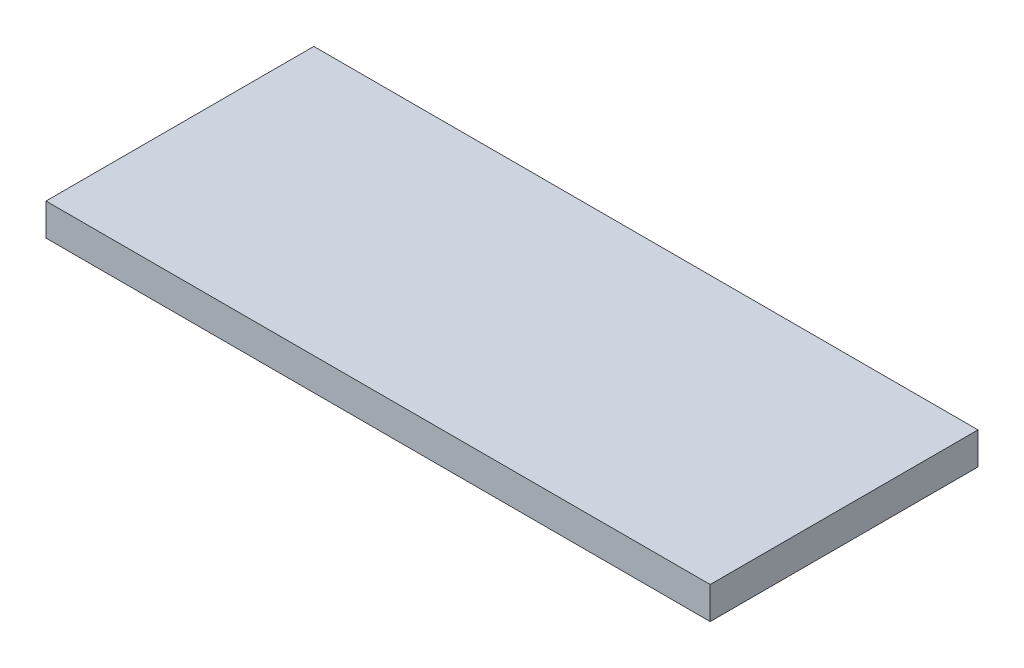
ISO-10303-21;
HEADER;
FILE_DESCRIPTION(('STEP AP214'),'2;1');
FILE_NAME('part.step','',(''),(''),'','','');
FILE_SCHEMA(('AUTOMOTIVE_DESIGN { 1 0 10303 214 1 1 1 1 }'));
ENDSEC;
DATA;
#1=APPLICATION_CONTEXT('core data for automotive mechanical design processes');
#2=APPLICATION_PROTOCOL_DEFINITION('international standard','automotive_design',2000,#1);
#3=PRODUCT_CONTEXT('',#1,'mechanical');
#4=PRODUCT('Part','Part','',(#3));
#5=PRODUCT_RELATED_PRODUCT_CATEGORY('part','',(#4));
#6=PRODUCT_DEFINITION_FORMATION('','',#4);
#7=PRODUCT_DEFINITION_CONTEXT('part definition',#1,'design');
#8=PRODUCT_DEFINITION('design','',#6,#7);
#9=PRODUCT_DEFINITION_SHAPE('','',#8);
#10=(LENGTH_UNIT() NAMED_UNIT(*) SI_UNIT(.MILLI.,.METRE.));
#11=(NAMED_UNIT(*) PLANE_ANGLE_UNIT() SI_UNIT($,.RADIAN.));
#12=(NAMED_UNIT(*) SI_UNIT($,.STERADIAN.) SOLID_ANGLE_UNIT());
#13=UNCERTAINTY_MEASURE_WITH_UNIT(LENGTH_MEASURE(1.E-05),#10,'distance_accuracy_value','');
#14=(GEOMETRIC_REPRESENTATION_CONTEXT(3) GLOBAL_UNCERTAINTY_ASSIGNED_CONTEXT((#13)) GLOBAL_UNIT_ASSIGNED_CONTEXT((#10,
#11,#12)) REPRESENTATION_CONTEXT('',''));
#15=CARTESIAN_POINT('',(0.,0.,0.));
#16=DIRECTION('',(0.,0.,1.));
#17=DIRECTION('',(1.,0.,0.));
#18=AXIS2_PLACEMENT_3D('',#15,#16,#17);
#19=CARTESIAN_POINT('',(-31.,3.,-12.5));
#20=DIRECTION('',(1.,0.,0.));
#21=DIRECTION('',(0.,0.,-1.));
#22=AXIS2_PLACEMENT_3D('',#19,#20,#21);
#23=PLANE('',#22);
#24=DIRECTION('',(0.,0.,1.));
#25=VECTOR('',#24,1.);
#26=CARTESIAN_POINT('',(-31.,0.,-12.5));
#27=LINE('',#26,#25);
#28=CARTESIAN_POINT('',(-31.,0.,-12.5));
#29=VERTEX_POINT('',#28);
#30=CARTESIAN_POINT('',(-31.,0.,12.5));
#31=VERTEX_POINT('',#30);
#32=EDGE_CURVE('E100',#29,#31,#27,.T.);
#33=ORIENTED_EDGE('',*,*,#32,.T.);
#34=DIRECTION('',(0.,-1.,0.));
#35=VECTOR('',#34,1.);
#36=CARTESIAN_POINT('',(-31.,3.,12.5));
#37=LINE('',#36,#35);
#38=CARTESIAN_POINT('',(-31.,3.,12.5));
#39=VERTEX_POINT('',#38);
#40=EDGE_CURVE('E11',#39,#31,#37,.T.);
#41=ORIENTED_EDGE('',*,*,#40,.F.);
#42=DIRECTION('',(0.,0.,1.));
#43=VECTOR('',#42,1.);
#44=CARTESIAN_POINT('',(-31.,3.,-12.5));
#45=LINE('',#44,#43);
#46=CARTESIAN_POINT('',(-31.,3.,-12.5));
#47=VERTEX_POINT('',#46);
#48=EDGE_CURVE('E88',#47,#39,#45,.T.);
#49=ORIENTED_EDGE('',*,*,#48,.F.);
#50=DIRECTION('',(0.,-1.,0.));
#51=VECTOR('',#50,1.);
#52=CARTESIAN_POINT('',(-31.,3.,-12.5));
#53=LINE('',#52,#51);
#54=EDGE_CURVE('E96',#47,#29,#53,.T.);
#55=ORIENTED_EDGE('',*,*,#54,.T.);
#56=EDGE_LOOP('',(#33,#41,#49,#55));
#57=FACE_BOUND('',#56,.T.);
#58=ADVANCED_FACE('F37',(#57),#23,.F.);
#59=CARTESIAN_POINT('',(31.,3.,12.5));
#60=DIRECTION('',(0.,0.,-1.));
#61=DIRECTION('',(-1.,0.,0.));
#62=AXIS2_PLACEMENT_3D('',#59,#60,#61);
#63=PLANE('',#62);
#64=DIRECTION('',(1.,0.,0.));
#65=VECTOR('',#64,1.);
#66=CARTESIAN_POINT('',(31.,0.,12.5));
#67=LINE('',#66,#65);
#68=CARTESIAN_POINT('',(31.,0.,12.5));
#69=VERTEX_POINT('',#68);
#70=EDGE_CURVE('E92',#31,#69,#67,.T.);
#71=ORIENTED_EDGE('',*,*,#70,.T.);
#72=DIRECTION('',(0.,-1.,0.));
#73=VECTOR('',#72,1.);
#74=CARTESIAN_POINT('',(31.,3.,12.5));
#75=LINE('',#74,#73);
#76=CARTESIAN_POINT('',(31.,3.,12.5));
#77=VERTEX_POINT('',#76);
#78=EDGE_CURVE('E45',#77,#69,#75,.T.);
#79=ORIENTED_EDGE('',*,*,#78,.F.);
#80=DIRECTION('',(1.,0.,0.));
#81=VECTOR('',#80,1.);
#82=CARTESIAN_POINT('',(31.,3.,12.5));
#83=LINE('',#82,#81);
#84=EDGE_CURVE('E83',#39,#77,#83,.T.);
#85=ORIENTED_EDGE('',*,*,#84,.F.);
#86=ORIENTED_EDGE('',*,*,#40,.T.);
#87=EDGE_LOOP('',(#71,#79,#85,#86));
#88=FACE_BOUND('',#87,.T.);
#89=ADVANCED_FACE('F91',(#88),#63,.F.);
#90=CARTESIAN_POINT('',(31.,3.,-12.5));
#91=DIRECTION('',(-1.,0.,0.));
#92=DIRECTION('',(0.,0.,1.));
#93=AXIS2_PLACEMENT_3D('',#90,#91,#92);
#94=PLANE('',#93);
#95=DIRECTION('',(0.,0.,-1.));
#96=VECTOR('',#95,1.);
#97=CARTESIAN_POINT('',(31.,0.,-12.5));
#98=LINE('',#97,#96);
#99=CARTESIAN_POINT('',(31.,0.,-12.5));
#100=VERTEX_POINT('',#99);
#101=EDGE_CURVE('E70',#69,#100,#98,.T.);
#102=ORIENTED_EDGE('',*,*,#101,.T.);
#103=DIRECTION('',(0.,-1.,0.));
#104=VECTOR('',#103,1.);
#105=CARTESIAN_POINT('',(31.,3.,-12.5));
#106=LINE('',#105,#104);
#107=CARTESIAN_POINT('',(31.,3.,-12.5));
#108=VERTEX_POINT('',#107);
#109=EDGE_CURVE('E93',#108,#100,#106,.T.);
#110=ORIENTED_EDGE('',*,*,#109,.F.);
#111=DIRECTION('',(0.,0.,-1.));
#112=VECTOR('',#111,1.);
#113=CARTESIAN_POINT('',(31.,3.,-12.5));
#114=LINE('',#113,#112);
#115=EDGE_CURVE('E86',#77,#108,#114,.T.);
#116=ORIENTED_EDGE('',*,*,#115,.F.);
#117=ORIENTED_EDGE('',*,*,#78,.T.);
#118=EDGE_LOOP('',(#102,#110,#116,#117));
#119=FACE_BOUND('',#118,.T.);
#120=ADVANCED_FACE('F94',(#119),#94,.F.);
#121=CARTESIAN_POINT('',(31.,3.,-12.5));
#122=DIRECTION('',(0.,0.,1.));
#123=DIRECTION('',(1.,0.,0.));
#124=AXIS2_PLACEMENT_3D('',#121,#122,#123);
#125=PLANE('',#124);
#126=DIRECTION('',(-1.,0.,0.));
#127=VECTOR('',#126,1.);
#128=CARTESIAN_POINT('',(31.,0.,-12.5));
#129=LINE('',#128,#127);
#130=EDGE_CURVE('E76',#100,#29,#129,.T.);
#131=ORIENTED_EDGE('',*,*,#130,.T.);
#132=ORIENTED_EDGE('',*,*,#54,.F.);
#133=DIRECTION('',(-1.,0.,0.));
#134=VECTOR('',#133,1.);
#135=CARTESIAN_POINT('',(31.,3.,-12.5));
#136=LINE('',#135,#134);
#137=EDGE_CURVE('E53',#108,#47,#136,.T.);
#138=ORIENTED_EDGE('',*,*,#137,.F.);
#139=ORIENTED_EDGE('',*,*,#109,.T.);
#140=EDGE_LOOP('',(#131,#132,#138,#139));
#141=FACE_BOUND('',#140,.T.);
#142=ADVANCED_FACE('F107',(#141),#125,.F.);
#143=CARTESIAN_POINT('',(0.,3.,0.));
#144=DIRECTION('',(0.,-1.,0.));
#145=DIRECTION('',(0.,0.,-1.));
#146=AXIS2_PLACEMENT_3D('',#143,#144,#145);
#147=PLANE('',#146);
#148=ORIENTED_EDGE('',*,*,#48,.T.);
#149=ORIENTED_EDGE('',*,*,#84,.T.);
#150=ORIENTED_EDGE('',*,*,#115,.T.);
#151=ORIENTED_EDGE('',*,*,#137,.T.);
#152=EDGE_LOOP('',(#148,#149,#150,#151));
#153=FACE_BOUND('',#152,.T.);
#154=ADVANCED_FACE('F84',(#153),#147,.F.);
#155=CARTESIAN_POINT('',(0.,0.,0.));
#156=DIRECTION('',(0.,-1.,0.));
#157=DIRECTION('',(0.,0.,-1.));
#158=AXIS2_PLACEMENT_3D('',#155,#156,#157);
#159=PLANE('',#158);
#160=ORIENTED_EDGE('',*,*,#32,.F.);
#161=ORIENTED_EDGE('',*,*,#130,.F.);
#162=ORIENTED_EDGE('',*,*,#101,.F.);
#163=ORIENTED_EDGE('',*,*,#70,.F.);
#164=EDGE_LOOP('',(#160,#161,#162,#163));
#165=FACE_BOUND('',#164,.T.);
#166=ADVANCED_FACE('F110',(#165),#159,.T.);
#167=CLOSED_SHELL('',(#58,#89,#120,#142,#154,#166));
#168=MANIFOLD_SOLID_BREP('B2',#167);
#169=ADVANCED_BREP_SHAPE_REPRESENTATION('',(#18,#168),#14);
#170=SHAPE_DEFINITION_REPRESENTATION(#9,#169);
ENDSEC;
END-ISO-10303-21;
